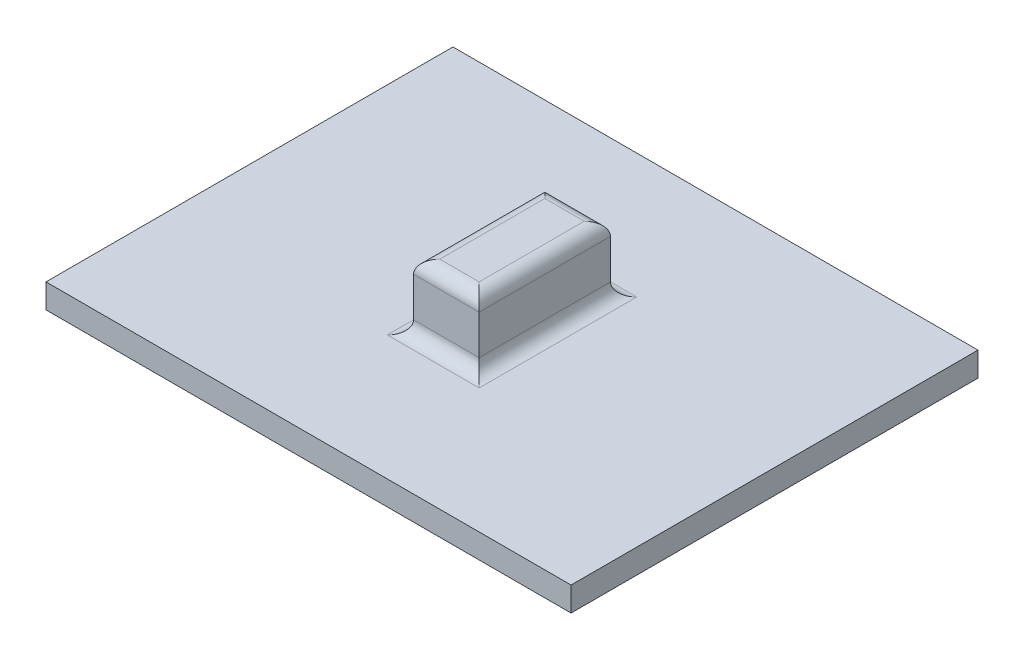
ISO-10303-21;
HEADER;
FILE_DESCRIPTION(('STEP AP214'),'2;1');
FILE_NAME('part.step','',(''),(''),'','','');
FILE_SCHEMA(('AUTOMOTIVE_DESIGN { 1 0 10303 214 1 1 1 1 }'));
ENDSEC;
DATA;
#1=APPLICATION_CONTEXT('core data for automotive mechanical design processes');
#2=APPLICATION_PROTOCOL_DEFINITION('international standard','automotive_design',2000,#1);
#3=PRODUCT_CONTEXT('',#1,'mechanical');
#4=PRODUCT('Part','Part','',(#3));
#5=PRODUCT_RELATED_PRODUCT_CATEGORY('part','',(#4));
#6=PRODUCT_DEFINITION_FORMATION('','',#4);
#7=PRODUCT_DEFINITION_CONTEXT('part definition',#1,'design');
#8=PRODUCT_DEFINITION('design','',#6,#7);
#9=PRODUCT_DEFINITION_SHAPE('','',#8);
#10=(LENGTH_UNIT() NAMED_UNIT(*) SI_UNIT(.MILLI.,.METRE.));
#11=(NAMED_UNIT(*) PLANE_ANGLE_UNIT() SI_UNIT($,.RADIAN.));
#12=(NAMED_UNIT(*) SI_UNIT($,.STERADIAN.) SOLID_ANGLE_UNIT());
#13=UNCERTAINTY_MEASURE_WITH_UNIT(LENGTH_MEASURE(1.E-05),#10,'distance_accuracy_value','');
#14=(GEOMETRIC_REPRESENTATION_CONTEXT(3) GLOBAL_UNCERTAINTY_ASSIGNED_CONTEXT((#13)) GLOBAL_UNIT_ASSIGNED_CONTEXT((#10,
#11,#12)) REPRESENTATION_CONTEXT('',''));
#15=CARTESIAN_POINT('',(0.,0.,0.));
#16=DIRECTION('',(0.,0.,1.));
#17=DIRECTION('',(1.,0.,0.));
#18=AXIS2_PLACEMENT_3D('',#15,#16,#17);
#19=CARTESIAN_POINT('',(0.,3.7,0.));
#20=DIRECTION('',(0.,-1.,0.));
#21=DIRECTION('',(0.,0.,-1.));
#22=AXIS2_PLACEMENT_3D('',#19,#20,#21);
#23=PLANE('',#22);
#24=DIRECTION('',(0.,0.,1.));
#25=VECTOR('',#24,1.);
#26=CARTESIAN_POINT('',(33.,3.7,-41.));
#27=LINE('',#26,#25);
#28=CARTESIAN_POINT('',(33.,3.7,-19.));
#29=VERTEX_POINT('',#28);
#30=CARTESIAN_POINT('',(33.,3.7,-43.));
#31=VERTEX_POINT('',#30);
#32=EDGE_CURVE('E150',#29,#31,#27,.F.);
#33=ORIENTED_EDGE('',*,*,#32,.T.);
#34=DIRECTION('',(-1.,0.,0.));
#35=VECTOR('',#34,1.);
#36=CARTESIAN_POINT('',(45.,3.7,-43.));
#37=LINE('',#36,#35);
#38=CARTESIAN_POINT('',(47.,3.7,-43.));
#39=VERTEX_POINT('',#38);
#40=EDGE_CURVE('E161',#31,#39,#37,.F.);
#41=ORIENTED_EDGE('',*,*,#40,.T.);
#42=DIRECTION('',(0.,0.,-1.));
#43=VECTOR('',#42,1.);
#44=CARTESIAN_POINT('',(47.,3.7,-21.));
#45=LINE('',#44,#43);
#46=CARTESIAN_POINT('',(47.,3.7,-19.));
#47=VERTEX_POINT('',#46);
#48=EDGE_CURVE('E159',#39,#47,#45,.F.);
#49=ORIENTED_EDGE('',*,*,#48,.T.);
#50=DIRECTION('',(1.,0.,0.));
#51=VECTOR('',#50,1.);
#52=CARTESIAN_POINT('',(35.,3.7,-19.));
#53=LINE('',#52,#51);
#54=EDGE_CURVE('E157',#47,#29,#53,.F.);
#55=ORIENTED_EDGE('',*,*,#54,.T.);
#56=EDGE_LOOP('',(#33,#41,#49,#55));
#57=FACE_BOUND('',#56,.T.);
#58=DIRECTION('',(0.,0.,1.));
#59=VECTOR('',#58,1.);
#60=CARTESIAN_POINT('',(0.,3.7,0.));
#61=LINE('',#60,#59);
#62=CARTESIAN_POINT('',(0.,3.7,-62.));
#63=VERTEX_POINT('',#62);
#64=CARTESIAN_POINT('',(0.,3.7,0.));
#65=VERTEX_POINT('',#64);
#66=EDGE_CURVE('E134',#63,#65,#61,.T.);
#67=ORIENTED_EDGE('',*,*,#66,.T.);
#68=DIRECTION('',(1.,0.,0.));
#69=VECTOR('',#68,1.);
#70=CARTESIAN_POINT('',(0.,3.7,0.));
#71=LINE('',#70,#69);
#72=CARTESIAN_POINT('',(80.,3.7,0.));
#73=VERTEX_POINT('',#72);
#74=EDGE_CURVE('E123',#65,#73,#71,.T.);
#75=ORIENTED_EDGE('',*,*,#74,.T.);
#76=DIRECTION('',(0.,0.,-1.));
#77=VECTOR('',#76,1.);
#78=CARTESIAN_POINT('',(80.,3.7,0.));
#79=LINE('',#78,#77);
#80=CARTESIAN_POINT('',(80.,3.7,-62.));
#81=VERTEX_POINT('',#80);
#82=EDGE_CURVE('E133',#73,#81,#79,.T.);
#83=ORIENTED_EDGE('',*,*,#82,.T.);
#84=DIRECTION('',(-1.,0.,0.));
#85=VECTOR('',#84,1.);
#86=CARTESIAN_POINT('',(0.,3.7,-62.));
#87=LINE('',#86,#85);
#88=EDGE_CURVE('E138',#81,#63,#87,.T.);
#89=ORIENTED_EDGE('',*,*,#88,.T.);
#90=EDGE_LOOP('',(#67,#75,#83,#89));
#91=FACE_BOUND('',#90,.T.);
#92=ADVANCED_FACE('F33',(#57,#91),#23,.F.);
#93=CARTESIAN_POINT('',(0.,3.7,0.));
#94=DIRECTION('',(1.,0.,0.));
#95=DIRECTION('',(0.,0.,-1.));
#96=AXIS2_PLACEMENT_3D('',#93,#94,#95);
#97=PLANE('',#96);
#98=DIRECTION('',(0.,0.,1.));
#99=VECTOR('',#98,1.);
#100=CARTESIAN_POINT('',(0.,0.,0.));
#101=LINE('',#100,#99);
#102=CARTESIAN_POINT('',(0.,0.,-62.));
#103=VERTEX_POINT('',#102);
#104=CARTESIAN_POINT('',(0.,0.,0.));
#105=VERTEX_POINT('',#104);
#106=EDGE_CURVE('E146',#103,#105,#101,.T.);
#107=ORIENTED_EDGE('',*,*,#106,.T.);
#108=DIRECTION('',(0.,-1.,0.));
#109=VECTOR('',#108,1.);
#110=CARTESIAN_POINT('',(0.,3.7,0.));
#111=LINE('',#110,#109);
#112=EDGE_CURVE('E127',#65,#105,#111,.T.);
#113=ORIENTED_EDGE('',*,*,#112,.F.);
#114=ORIENTED_EDGE('',*,*,#66,.F.);
#115=DIRECTION('',(0.,-1.,0.));
#116=VECTOR('',#115,1.);
#117=CARTESIAN_POINT('',(0.,3.7,-62.));
#118=LINE('',#117,#116);
#119=EDGE_CURVE('E385',#63,#103,#118,.T.);
#120=ORIENTED_EDGE('',*,*,#119,.T.);
#121=EDGE_LOOP('',(#107,#113,#114,#120));
#122=FACE_BOUND('',#121,.T.);
#123=ADVANCED_FACE('F144',(#122),#97,.F.);
#124=CARTESIAN_POINT('',(0.,3.7,0.));
#125=DIRECTION('',(0.,0.,-1.));
#126=DIRECTION('',(-1.,0.,0.));
#127=AXIS2_PLACEMENT_3D('',#124,#125,#126);
#128=PLANE('',#127);
#129=DIRECTION('',(1.,0.,0.));
#130=VECTOR('',#129,1.);
#131=CARTESIAN_POINT('',(0.,0.,0.));
#132=LINE('',#131,#130);
#133=CARTESIAN_POINT('',(80.,0.,0.));
#134=VERTEX_POINT('',#133);
#135=EDGE_CURVE('E387',#105,#134,#132,.T.);
#136=ORIENTED_EDGE('',*,*,#135,.T.);
#137=DIRECTION('',(0.,-1.,0.));
#138=VECTOR('',#137,1.);
#139=CARTESIAN_POINT('',(80.,3.7,0.));
#140=LINE('',#139,#138);
#141=EDGE_CURVE('E130',#73,#134,#140,.T.);
#142=ORIENTED_EDGE('',*,*,#141,.F.);
#143=ORIENTED_EDGE('',*,*,#74,.F.);
#144=ORIENTED_EDGE('',*,*,#112,.T.);
#145=EDGE_LOOP('',(#136,#142,#143,#144));
#146=FACE_BOUND('',#145,.T.);
#147=ADVANCED_FACE('F125',(#146),#128,.F.);
#148=CARTESIAN_POINT('',(80.,3.7,0.));
#149=DIRECTION('',(-1.,0.,0.));
#150=DIRECTION('',(0.,0.,1.));
#151=AXIS2_PLACEMENT_3D('',#148,#149,#150);
#152=PLANE('',#151);
#153=DIRECTION('',(0.,0.,-1.));
#154=VECTOR('',#153,1.);
#155=CARTESIAN_POINT('',(80.,0.,0.));
#156=LINE('',#155,#154);
#157=CARTESIAN_POINT('',(80.,0.,-62.));
#158=VERTEX_POINT('',#157);
#159=EDGE_CURVE('E389',#134,#158,#156,.T.);
#160=ORIENTED_EDGE('',*,*,#159,.T.);
#161=DIRECTION('',(0.,-1.,0.));
#162=VECTOR('',#161,1.);
#163=CARTESIAN_POINT('',(80.,3.7,-62.));
#164=LINE('',#163,#162);
#165=EDGE_CURVE('E152',#81,#158,#164,.T.);
#166=ORIENTED_EDGE('',*,*,#165,.F.);
#167=ORIENTED_EDGE('',*,*,#82,.F.);
#168=ORIENTED_EDGE('',*,*,#141,.T.);
#169=EDGE_LOOP('',(#160,#166,#167,#168));
#170=FACE_BOUND('',#169,.T.);
#171=ADVANCED_FACE('F262',(#170),#152,.F.);
#172=CARTESIAN_POINT('',(0.,3.7,-62.));
#173=DIRECTION('',(0.,0.,1.));
#174=DIRECTION('',(1.,0.,0.));
#175=AXIS2_PLACEMENT_3D('',#172,#173,#174);
#176=PLANE('',#175);
#177=DIRECTION('',(-1.,0.,0.));
#178=VECTOR('',#177,1.);
#179=CARTESIAN_POINT('',(0.,0.,-62.));
#180=LINE('',#179,#178);
#181=EDGE_CURVE('E142',#158,#103,#180,.T.);
#182=ORIENTED_EDGE('',*,*,#181,.T.);
#183=ORIENTED_EDGE('',*,*,#119,.F.);
#184=ORIENTED_EDGE('',*,*,#88,.F.);
#185=ORIENTED_EDGE('',*,*,#165,.T.);
#186=EDGE_LOOP('',(#182,#183,#184,#185));
#187=FACE_BOUND('',#186,.T.);
#188=ADVANCED_FACE('F258',(#187),#176,.F.);
#189=CARTESIAN_POINT('',(0.,0.,0.));
#190=DIRECTION('',(0.,-1.,0.));
#191=DIRECTION('',(0.,0.,-1.));
#192=AXIS2_PLACEMENT_3D('',#189,#190,#191);
#193=PLANE('',#192);
#194=ORIENTED_EDGE('',*,*,#106,.F.);
#195=ORIENTED_EDGE('',*,*,#181,.F.);
#196=ORIENTED_EDGE('',*,*,#159,.F.);
#197=ORIENTED_EDGE('',*,*,#135,.F.);
#198=EDGE_LOOP('',(#194,#195,#196,#197));
#199=FACE_BOUND('',#198,.T.);
#200=ADVANCED_FACE('F255',(#199),#193,.T.);
#201=CARTESIAN_POINT('',(35.,13.7,-41.));
#202=DIRECTION('',(1.,0.,0.));
#203=DIRECTION('',(0.,0.,-1.));
#204=AXIS2_PLACEMENT_3D('',#201,#202,#203);
#205=PLANE('',#204);
#206=DIRECTION('',(0.,-1.,0.));
#207=VECTOR('',#206,1.);
#208=CARTESIAN_POINT('',(35.,13.7,-21.));
#209=LINE('',#208,#207);
#210=CARTESIAN_POINT('',(35.,11.7,-21.));
#211=VERTEX_POINT('',#210);
#212=CARTESIAN_POINT('',(35.,5.7,-21.));
#213=VERTEX_POINT('',#212);
#214=EDGE_CURVE('E221',#211,#213,#209,.T.);
#215=ORIENTED_EDGE('',*,*,#214,.F.);
#216=DIRECTION('',(0.,0.,1.));
#217=VECTOR('',#216,1.);
#218=CARTESIAN_POINT('',(35.,11.7,-41.));
#219=LINE('',#218,#217);
#220=CARTESIAN_POINT('',(35.,11.7,-41.));
#221=VERTEX_POINT('',#220);
#222=EDGE_CURVE('E11',#211,#221,#219,.F.);
#223=ORIENTED_EDGE('',*,*,#222,.T.);
#224=DIRECTION('',(0.,-1.,0.));
#225=VECTOR('',#224,1.);
#226=CARTESIAN_POINT('',(35.,13.7,-41.));
#227=LINE('',#226,#225);
#228=CARTESIAN_POINT('',(35.,5.7,-41.));
#229=VERTEX_POINT('',#228);
#230=EDGE_CURVE('E185',#221,#229,#227,.T.);
#231=ORIENTED_EDGE('',*,*,#230,.T.);
#232=DIRECTION('',(0.,0.,1.));
#233=VECTOR('',#232,1.);
#234=CARTESIAN_POINT('',(35.,5.7,-21.));
#235=LINE('',#234,#233);
#236=EDGE_CURVE('E170',#229,#213,#235,.T.);
#237=ORIENTED_EDGE('',*,*,#236,.T.);
#238=EDGE_LOOP('',(#215,#223,#231,#237));
#239=FACE_BOUND('',#238,.T.);
#240=ADVANCED_FACE('F220',(#239),#205,.F.);
#241=CARTESIAN_POINT('',(35.,13.7,-21.));
#242=DIRECTION('',(0.,0.,-1.));
#243=DIRECTION('',(-1.,0.,0.));
#244=AXIS2_PLACEMENT_3D('',#241,#242,#243);
#245=PLANE('',#244);
#246=DIRECTION('',(0.,-1.,0.));
#247=VECTOR('',#246,1.);
#248=CARTESIAN_POINT('',(45.,13.7,-21.));
#249=LINE('',#248,#247);
#250=CARTESIAN_POINT('',(45.,11.7,-21.));
#251=VERTEX_POINT('',#250);
#252=CARTESIAN_POINT('',(45.,5.7,-21.));
#253=VERTEX_POINT('',#252);
#254=EDGE_CURVE('E378',#251,#253,#249,.T.);
#255=ORIENTED_EDGE('',*,*,#254,.F.);
#256=DIRECTION('',(1.,0.,0.));
#257=VECTOR('',#256,1.);
#258=CARTESIAN_POINT('',(35.,11.7,-21.));
#259=LINE('',#258,#257);
#260=EDGE_CURVE('E42',#251,#211,#259,.F.);
#261=ORIENTED_EDGE('',*,*,#260,.T.);
#262=ORIENTED_EDGE('',*,*,#214,.T.);
#263=DIRECTION('',(1.,0.,0.));
#264=VECTOR('',#263,1.);
#265=CARTESIAN_POINT('',(45.,5.7,-21.));
#266=LINE('',#265,#264);
#267=EDGE_CURVE('E167',#213,#253,#266,.T.);
#268=ORIENTED_EDGE('',*,*,#267,.T.);
#269=EDGE_LOOP('',(#255,#261,#262,#268));
#270=FACE_BOUND('',#269,.T.);
#271=ADVANCED_FACE('F349',(#270),#245,.F.);
#272=CARTESIAN_POINT('',(45.,13.7,-41.));
#273=DIRECTION('',(-1.,0.,0.));
#274=DIRECTION('',(0.,0.,1.));
#275=AXIS2_PLACEMENT_3D('',#272,#273,#274);
#276=PLANE('',#275);
#277=DIRECTION('',(0.,-1.,0.));
#278=VECTOR('',#277,1.);
#279=CARTESIAN_POINT('',(45.,13.7,-41.));
#280=LINE('',#279,#278);
#281=CARTESIAN_POINT('',(45.,11.7,-41.));
#282=VERTEX_POINT('',#281);
#283=CARTESIAN_POINT('',(45.,5.7,-41.));
#284=VERTEX_POINT('',#283);
#285=EDGE_CURVE('E226',#282,#284,#280,.T.);
#286=ORIENTED_EDGE('',*,*,#285,.F.);
#287=DIRECTION('',(0.,0.,-1.));
#288=VECTOR('',#287,1.);
#289=CARTESIAN_POINT('',(45.,11.7,-21.));
#290=LINE('',#289,#288);
#291=EDGE_CURVE('E57',#282,#251,#290,.F.);
#292=ORIENTED_EDGE('',*,*,#291,.T.);
#293=ORIENTED_EDGE('',*,*,#254,.T.);
#294=DIRECTION('',(0.,0.,-1.));
#295=VECTOR('',#294,1.);
#296=CARTESIAN_POINT('',(45.,5.7,-41.));
#297=LINE('',#296,#295);
#298=EDGE_CURVE('E164',#253,#284,#297,.T.);
#299=ORIENTED_EDGE('',*,*,#298,.T.);
#300=EDGE_LOOP('',(#286,#292,#293,#299));
#301=FACE_BOUND('',#300,.T.);
#302=ADVANCED_FACE('F243',(#301),#276,.F.);
#303=CARTESIAN_POINT('',(35.,13.7,-41.));
#304=DIRECTION('',(0.,0.,1.));
#305=DIRECTION('',(1.,0.,0.));
#306=AXIS2_PLACEMENT_3D('',#303,#304,#305);
#307=PLANE('',#306);
#308=ORIENTED_EDGE('',*,*,#230,.F.);
#309=DIRECTION('',(-1.,0.,0.));
#310=VECTOR('',#309,1.);
#311=CARTESIAN_POINT('',(45.,11.7,-41.));
#312=LINE('',#311,#310);
#313=EDGE_CURVE('E194',#221,#282,#312,.F.);
#314=ORIENTED_EDGE('',*,*,#313,.T.);
#315=ORIENTED_EDGE('',*,*,#285,.T.);
#316=DIRECTION('',(-1.,0.,0.));
#317=VECTOR('',#316,1.);
#318=CARTESIAN_POINT('',(35.,5.7,-41.));
#319=LINE('',#318,#317);
#320=EDGE_CURVE('E147',#284,#229,#319,.T.);
#321=ORIENTED_EDGE('',*,*,#320,.T.);
#322=EDGE_LOOP('',(#308,#314,#315,#321));
#323=FACE_BOUND('',#322,.T.);
#324=ADVANCED_FACE('F224',(#323),#307,.F.);
#325=CARTESIAN_POINT('',(0.,13.7,0.));
#326=DIRECTION('',(0.,1.,0.));
#327=DIRECTION('',(0.,0.,1.));
#328=AXIS2_PLACEMENT_3D('',#325,#326,#327);
#329=PLANE('',#328);
#330=DIRECTION('',(0.,0.,-1.));
#331=VECTOR('',#330,1.);
#332=CARTESIAN_POINT('',(43.,13.7,-41.));
#333=LINE('',#332,#331);
#334=CARTESIAN_POINT('',(43.,13.7,-23.));
#335=VERTEX_POINT('',#334);
#336=CARTESIAN_POINT('',(43.,13.7,-39.));
#337=VERTEX_POINT('',#336);
#338=EDGE_CURVE('E189',#335,#337,#333,.T.);
#339=ORIENTED_EDGE('',*,*,#338,.T.);
#340=DIRECTION('',(-1.,0.,0.));
#341=VECTOR('',#340,1.);
#342=CARTESIAN_POINT('',(35.,13.7,-39.));
#343=LINE('',#342,#341);
#344=CARTESIAN_POINT('',(37.,13.7,-39.));
#345=VERTEX_POINT('',#344);
#346=EDGE_CURVE('E191',#337,#345,#343,.T.);
#347=ORIENTED_EDGE('',*,*,#346,.T.);
#348=DIRECTION('',(0.,0.,1.));
#349=VECTOR('',#348,1.);
#350=CARTESIAN_POINT('',(37.,13.7,-21.));
#351=LINE('',#350,#349);
#352=CARTESIAN_POINT('',(37.,13.7,-23.));
#353=VERTEX_POINT('',#352);
#354=EDGE_CURVE('E173',#345,#353,#351,.T.);
#355=ORIENTED_EDGE('',*,*,#354,.T.);
#356=DIRECTION('',(1.,0.,0.));
#357=VECTOR('',#356,1.);
#358=CARTESIAN_POINT('',(45.,13.7,-23.));
#359=LINE('',#358,#357);
#360=EDGE_CURVE('E187',#353,#335,#359,.T.);
#361=ORIENTED_EDGE('',*,*,#360,.T.);
#362=EDGE_LOOP('',(#339,#347,#355,#361));
#363=FACE_BOUND('',#362,.T.);
#364=ADVANCED_FACE('F232',(#363),#329,.T.);
#365=CARTESIAN_POINT('',(35.,5.7,-19.));
#366=DIRECTION('',(-1.,0.,0.));
#367=DIRECTION('',(0.,0.,1.));
#368=AXIS2_PLACEMENT_3D('',#365,#366,#367);
#369=CYLINDRICAL_SURFACE('',#368,2.);
#370=CARTESIAN_POINT('',(33.,5.7,-19.));
#371=DIRECTION('',(-0.707106781186547,0.,-0.707106781186547));
#372=DIRECTION('',(0.707106781186547,0.,-0.707106781186547));
#373=AXIS2_PLACEMENT_3D('',#370,#371,#372);
#374=ELLIPSE('',#373,2.82842712474619,2.);
#375=EDGE_CURVE('E179',#29,#213,#374,.F.);
#376=ORIENTED_EDGE('',*,*,#375,.F.);
#377=ORIENTED_EDGE('',*,*,#54,.F.);
#378=CARTESIAN_POINT('',(47.,5.7,-19.));
#379=DIRECTION('',(-0.707106781186547,0.,0.707106781186547));
#380=DIRECTION('',(-0.707106781186547,0.,-0.707106781186547));
#381=AXIS2_PLACEMENT_3D('',#378,#379,#380);
#382=ELLIPSE('',#381,2.82842712474619,2.);
#383=EDGE_CURVE('E182',#253,#47,#382,.T.);
#384=ORIENTED_EDGE('',*,*,#383,.F.);
#385=ORIENTED_EDGE('',*,*,#267,.F.);
#386=EDGE_LOOP('',(#376,#377,#384,#385));
#387=FACE_BOUND('',#386,.T.);
#388=ADVANCED_FACE('F234',(#387),#369,.F.);
#389=CARTESIAN_POINT('',(47.,5.7,-41.));
#390=DIRECTION('',(0.,0.,1.));
#391=DIRECTION('',(1.,0.,0.));
#392=AXIS2_PLACEMENT_3D('',#389,#390,#391);
#393=CYLINDRICAL_SURFACE('',#392,2.);
#394=ORIENTED_EDGE('',*,*,#383,.T.);
#395=ORIENTED_EDGE('',*,*,#48,.F.);
#396=CARTESIAN_POINT('',(47.,5.7,-43.));
#397=DIRECTION('',(0.707106781186547,0.,0.707106781186547));
#398=DIRECTION('',(-0.707106781186547,0.,0.707106781186547));
#399=AXIS2_PLACEMENT_3D('',#396,#397,#398);
#400=ELLIPSE('',#399,2.82842712474619,2.);
#401=EDGE_CURVE('E177',#284,#39,#400,.T.);
#402=ORIENTED_EDGE('',*,*,#401,.F.);
#403=ORIENTED_EDGE('',*,*,#298,.F.);
#404=EDGE_LOOP('',(#394,#395,#402,#403));
#405=FACE_BOUND('',#404,.T.);
#406=ADVANCED_FACE('F240',(#405),#393,.F.);
#407=CARTESIAN_POINT('',(33.,5.7,-41.));
#408=DIRECTION('',(0.,0.,-1.));
#409=DIRECTION('',(-1.,0.,0.));
#410=AXIS2_PLACEMENT_3D('',#407,#408,#409);
#411=CYLINDRICAL_SURFACE('',#410,2.);
#412=ORIENTED_EDGE('',*,*,#375,.T.);
#413=ORIENTED_EDGE('',*,*,#236,.F.);
#414=CARTESIAN_POINT('',(33.,5.7,-43.));
#415=DIRECTION('',(0.707106781186547,0.,-0.707106781186547));
#416=DIRECTION('',(-0.707106781186547,0.,-0.707106781186547));
#417=AXIS2_PLACEMENT_3D('',#414,#415,#416);
#418=ELLIPSE('',#417,2.82842712474619,2.);
#419=EDGE_CURVE('E174',#31,#229,#418,.F.);
#420=ORIENTED_EDGE('',*,*,#419,.F.);
#421=ORIENTED_EDGE('',*,*,#32,.F.);
#422=EDGE_LOOP('',(#412,#413,#420,#421));
#423=FACE_BOUND('',#422,.T.);
#424=ADVANCED_FACE('F272',(#423),#411,.F.);
#425=CARTESIAN_POINT('',(35.,5.7,-43.));
#426=DIRECTION('',(1.,0.,0.));
#427=DIRECTION('',(0.,0.,-1.));
#428=AXIS2_PLACEMENT_3D('',#425,#426,#427);
#429=CYLINDRICAL_SURFACE('',#428,2.);
#430=ORIENTED_EDGE('',*,*,#401,.T.);
#431=ORIENTED_EDGE('',*,*,#40,.F.);
#432=ORIENTED_EDGE('',*,*,#419,.T.);
#433=ORIENTED_EDGE('',*,*,#320,.F.);
#434=EDGE_LOOP('',(#430,#431,#432,#433));
#435=FACE_BOUND('',#434,.T.);
#436=ADVANCED_FACE('F269',(#435),#429,.F.);
#437=CARTESIAN_POINT('',(0.,11.7,-23.));
#438=DIRECTION('',(-1.,0.,0.));
#439=DIRECTION('',(0.,0.,1.));
#440=AXIS2_PLACEMENT_3D('',#437,#438,#439);
#441=CYLINDRICAL_SURFACE('',#440,2.);
#442=CARTESIAN_POINT('',(37.,11.7,-23.));
#443=DIRECTION('',(-0.707106781186547,0.,-0.707106781186547));
#444=DIRECTION('',(0.707106781186547,0.,-0.707106781186547));
#445=AXIS2_PLACEMENT_3D('',#442,#443,#444);
#446=ELLIPSE('',#445,2.82842712474619,2.);
#447=EDGE_CURVE('E202',#211,#353,#446,.T.);
#448=ORIENTED_EDGE('',*,*,#447,.F.);
#449=ORIENTED_EDGE('',*,*,#260,.F.);
#450=CARTESIAN_POINT('',(43.,11.7,-23.));
#451=DIRECTION('',(-0.707106781186547,0.,0.707106781186547));
#452=DIRECTION('',(-0.707106781186547,0.,-0.707106781186547));
#453=AXIS2_PLACEMENT_3D('',#450,#451,#452);
#454=ELLIPSE('',#453,2.82842712474619,2.);
#455=EDGE_CURVE('E37',#335,#251,#454,.F.);
#456=ORIENTED_EDGE('',*,*,#455,.F.);
#457=ORIENTED_EDGE('',*,*,#360,.F.);
#458=EDGE_LOOP('',(#448,#449,#456,#457));
#459=FACE_BOUND('',#458,.T.);
#460=ADVANCED_FACE('F35',(#459),#441,.T.);
#461=CARTESIAN_POINT('',(43.,11.7,0.));
#462=DIRECTION('',(0.,0.,1.));
#463=DIRECTION('',(1.,0.,0.));
#464=AXIS2_PLACEMENT_3D('',#461,#462,#463);
#465=CYLINDRICAL_SURFACE('',#464,2.);
#466=ORIENTED_EDGE('',*,*,#455,.T.);
#467=ORIENTED_EDGE('',*,*,#291,.F.);
#468=CARTESIAN_POINT('',(43.,11.7,-39.));
#469=DIRECTION('',(0.707106781186547,0.,0.707106781186547));
#470=DIRECTION('',(-0.707106781186547,0.,0.707106781186547));
#471=AXIS2_PLACEMENT_3D('',#468,#469,#470);
#472=ELLIPSE('',#471,2.82842712474619,2.);
#473=EDGE_CURVE('E201',#337,#282,#472,.F.);
#474=ORIENTED_EDGE('',*,*,#473,.F.);
#475=ORIENTED_EDGE('',*,*,#338,.F.);
#476=EDGE_LOOP('',(#466,#467,#474,#475));
#477=FACE_BOUND('',#476,.T.);
#478=ADVANCED_FACE('F212',(#477),#465,.T.);
#479=CARTESIAN_POINT('',(37.,11.7,0.));
#480=DIRECTION('',(0.,0.,-1.));
#481=DIRECTION('',(-1.,0.,0.));
#482=AXIS2_PLACEMENT_3D('',#479,#480,#481);
#483=CYLINDRICAL_SURFACE('',#482,2.);
#484=ORIENTED_EDGE('',*,*,#447,.T.);
#485=ORIENTED_EDGE('',*,*,#354,.F.);
#486=CARTESIAN_POINT('',(37.,11.7,-39.));
#487=DIRECTION('',(0.707106781186547,0.,-0.707106781186547));
#488=DIRECTION('',(-0.707106781186547,0.,-0.707106781186547));
#489=AXIS2_PLACEMENT_3D('',#486,#487,#488);
#490=ELLIPSE('',#489,2.82842712474619,2.);
#491=EDGE_CURVE('E199',#221,#345,#490,.T.);
#492=ORIENTED_EDGE('',*,*,#491,.F.);
#493=ORIENTED_EDGE('',*,*,#222,.F.);
#494=EDGE_LOOP('',(#484,#485,#492,#493));
#495=FACE_BOUND('',#494,.T.);
#496=ADVANCED_FACE('F217',(#495),#483,.T.);
#497=CARTESIAN_POINT('',(0.,11.7,-39.));
#498=DIRECTION('',(1.,0.,0.));
#499=DIRECTION('',(0.,0.,-1.));
#500=AXIS2_PLACEMENT_3D('',#497,#498,#499);
#501=CYLINDRICAL_SURFACE('',#500,2.);
#502=ORIENTED_EDGE('',*,*,#473,.T.);
#503=ORIENTED_EDGE('',*,*,#313,.F.);
#504=ORIENTED_EDGE('',*,*,#491,.T.);
#505=ORIENTED_EDGE('',*,*,#346,.F.);
#506=EDGE_LOOP('',(#502,#503,#504,#505));
#507=FACE_BOUND('',#506,.T.);
#508=ADVANCED_FACE('F229',(#507),#501,.T.);
#509=CLOSED_SHELL('',(#92,#123,#147,#171,#188,#200,#240,#271,#302,#324,#364,#388,#406,#424,#436,
#460,#478,#496,#508));
#510=MANIFOLD_SOLID_BREP('B2',#509);
#511=ADVANCED_BREP_SHAPE_REPRESENTATION('',(#18,#510),#14);
#512=SHAPE_DEFINITION_REPRESENTATION(#9,#511);
ENDSEC;
END-ISO-10303-21;
